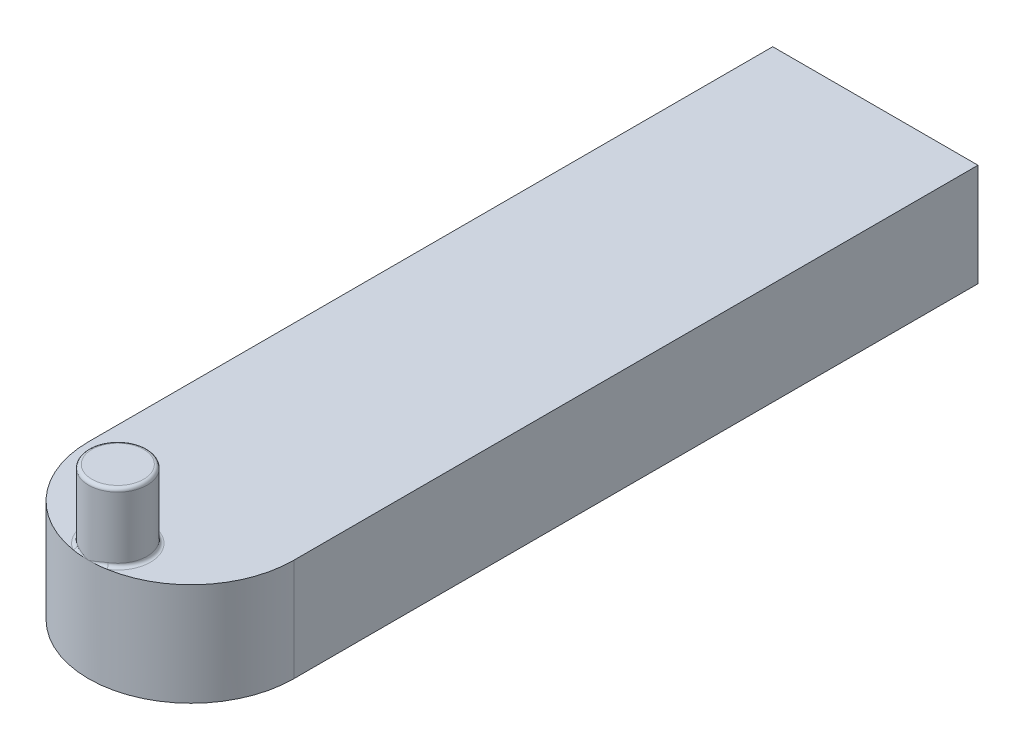
ISO-10303-21;
HEADER;
FILE_DESCRIPTION(('STEP AP214'),'2;1');
FILE_NAME('part.step','',(''),(''),'','','');
FILE_SCHEMA(('AUTOMOTIVE_DESIGN { 1 0 10303 214 1 1 1 1 }'));
ENDSEC;
DATA;
#1=APPLICATION_CONTEXT('core data for automotive mechanical design processes');
#2=APPLICATION_PROTOCOL_DEFINITION('international standard','automotive_design',2000,#1);
#3=PRODUCT_CONTEXT('',#1,'mechanical');
#4=PRODUCT('Part','Part','',(#3));
#5=PRODUCT_RELATED_PRODUCT_CATEGORY('part','',(#4));
#6=PRODUCT_DEFINITION_FORMATION('','',#4);
#7=PRODUCT_DEFINITION_CONTEXT('part definition',#1,'design');
#8=PRODUCT_DEFINITION('design','',#6,#7);
#9=PRODUCT_DEFINITION_SHAPE('','',#8);
#10=(LENGTH_UNIT() NAMED_UNIT(*) SI_UNIT(.MILLI.,.METRE.));
#11=(NAMED_UNIT(*) PLANE_ANGLE_UNIT() SI_UNIT($,.RADIAN.));
#12=(NAMED_UNIT(*) SI_UNIT($,.STERADIAN.) SOLID_ANGLE_UNIT());
#13=UNCERTAINTY_MEASURE_WITH_UNIT(LENGTH_MEASURE(1.E-05),#10,'distance_accuracy_value','');
#14=(GEOMETRIC_REPRESENTATION_CONTEXT(3) GLOBAL_UNCERTAINTY_ASSIGNED_CONTEXT((#13)) GLOBAL_UNIT_ASSIGNED_CONTEXT((#10,
#11,#12)) REPRESENTATION_CONTEXT('',''));
#15=CARTESIAN_POINT('',(0.,0.,0.));
#16=DIRECTION('',(0.,0.,1.));
#17=DIRECTION('',(1.,0.,0.));
#18=AXIS2_PLACEMENT_3D('',#15,#16,#17);
#19=CARTESIAN_POINT('',(0.,6.,0.));
#20=DIRECTION('',(0.,-1.,0.));
#21=DIRECTION('',(0.,0.,-1.));
#22=AXIS2_PLACEMENT_3D('',#19,#20,#21);
#23=CYLINDRICAL_SURFACE('',#22,6.);
#24=CARTESIAN_POINT('',(0.,0.,0.));
#25=DIRECTION('',(0.,1.,0.));
#26=DIRECTION('',(0.,0.,1.));
#27=AXIS2_PLACEMENT_3D('',#24,#25,#26);
#28=CIRCLE('',#27,6.);
#29=CARTESIAN_POINT('',(-6.,0.,0.));
#30=VERTEX_POINT('',#29);
#31=CARTESIAN_POINT('',(6.,0.,0.));
#32=VERTEX_POINT('',#31);
#33=EDGE_CURVE('E240',#30,#32,#28,.T.);
#34=ORIENTED_EDGE('',*,*,#33,.T.);
#35=DIRECTION('',(0.,-1.,0.));
#36=VECTOR('',#35,1.);
#37=CARTESIAN_POINT('',(6.,6.,0.));
#38=LINE('',#37,#36);
#39=CARTESIAN_POINT('',(6.,6.,0.));
#40=VERTEX_POINT('',#39);
#41=EDGE_CURVE('E216',#40,#32,#38,.T.);
#42=ORIENTED_EDGE('',*,*,#41,.F.);
#43=CARTESIAN_POINT('',(0.,6.,0.));
#44=DIRECTION('',(0.,1.,0.));
#45=DIRECTION('',(0.,0.,1.));
#46=AXIS2_PLACEMENT_3D('',#43,#44,#45);
#47=CIRCLE('',#46,6.);
#48=CARTESIAN_POINT('',(1.00376067843676,6.,5.91544288286382));
#49=VERTEX_POINT('',#48);
#50=EDGE_CURVE('E116',#49,#40,#47,.T.);
#51=ORIENTED_EDGE('',*,*,#50,.F.);
#52=CARTESIAN_POINT('',(0.,6.,6.));
#53=VERTEX_POINT('',#52);
#54=EDGE_CURVE('E120',#53,#49,#47,.T.);
#55=ORIENTED_EDGE('',*,*,#54,.F.);
#56=CARTESIAN_POINT('',(-1.00376067843676,6.,5.91544288286382));
#57=VERTEX_POINT('',#56);
#58=EDGE_CURVE('E70',#57,#53,#47,.T.);
#59=ORIENTED_EDGE('',*,*,#58,.F.);
#60=CARTESIAN_POINT('',(-6.,6.,0.));
#61=VERTEX_POINT('',#60);
#62=EDGE_CURVE('E123',#61,#57,#47,.T.);
#63=ORIENTED_EDGE('',*,*,#62,.F.);
#64=DIRECTION('',(0.,-1.,0.));
#65=VECTOR('',#64,1.);
#66=CARTESIAN_POINT('',(-6.,6.,0.));
#67=LINE('',#66,#65);
#68=EDGE_CURVE('E230',#61,#30,#67,.T.);
#69=ORIENTED_EDGE('',*,*,#68,.T.);
#70=EDGE_LOOP('',(#34,#42,#51,#55,#59,#63,#69));
#71=FACE_BOUND('',#70,.T.);
#72=ADVANCED_FACE('F41',(#71),#23,.T.);
#73=CARTESIAN_POINT('',(6.,6.,0.));
#74=DIRECTION('',(-1.,0.,0.));
#75=DIRECTION('',(0.,0.,1.));
#76=AXIS2_PLACEMENT_3D('',#73,#74,#75);
#77=PLANE('',#76);
#78=DIRECTION('',(0.,0.,-1.));
#79=VECTOR('',#78,1.);
#80=CARTESIAN_POINT('',(6.,0.,0.));
#81=LINE('',#80,#79);
#82=CARTESIAN_POINT('',(6.,0.,-40.));
#83=VERTEX_POINT('',#82);
#84=EDGE_CURVE('E235',#32,#83,#81,.T.);
#85=ORIENTED_EDGE('',*,*,#84,.T.);
#86=DIRECTION('',(0.,-1.,0.));
#87=VECTOR('',#86,1.);
#88=CARTESIAN_POINT('',(6.,6.,-40.));
#89=LINE('',#88,#87);
#90=CARTESIAN_POINT('',(6.,6.,-40.));
#91=VERTEX_POINT('',#90);
#92=EDGE_CURVE('E217',#91,#83,#89,.T.);
#93=ORIENTED_EDGE('',*,*,#92,.F.);
#94=DIRECTION('',(0.,0.,-1.));
#95=VECTOR('',#94,1.);
#96=CARTESIAN_POINT('',(6.,6.,0.));
#97=LINE('',#96,#95);
#98=EDGE_CURVE('E243',#40,#91,#97,.T.);
#99=ORIENTED_EDGE('',*,*,#98,.F.);
#100=ORIENTED_EDGE('',*,*,#41,.T.);
#101=EDGE_LOOP('',(#85,#93,#99,#100));
#102=FACE_BOUND('',#101,.T.);
#103=ADVANCED_FACE('F168',(#102),#77,.F.);
#104=CARTESIAN_POINT('',(-6.,6.,-40.));
#105=DIRECTION('',(0.,0.,1.));
#106=DIRECTION('',(1.,0.,0.));
#107=AXIS2_PLACEMENT_3D('',#104,#105,#106);
#108=PLANE('',#107);
#109=CARTESIAN_POINT('',(0.,3.,-40.));
#110=DIRECTION('',(0.,0.,-1.));
#111=DIRECTION('',(-1.,0.,0.));
#112=AXIS2_PLACEMENT_3D('',#109,#110,#111);
#113=CIRCLE('',#112,2.5);
#114=CARTESIAN_POINT('',(-2.5,3.,-40.));
#115=VERTEX_POINT('',#114);
#116=EDGE_CURVE('E184',#115,#115,#113,.T.);
#117=ORIENTED_EDGE('',*,*,#116,.F.);
#118=EDGE_LOOP('',(#117));
#119=FACE_BOUND('',#118,.T.);
#120=DIRECTION('',(-1.,0.,0.));
#121=VECTOR('',#120,1.);
#122=CARTESIAN_POINT('',(-6.,0.,-40.));
#123=LINE('',#122,#121);
#124=CARTESIAN_POINT('',(-6.,0.,-40.));
#125=VERTEX_POINT('',#124);
#126=EDGE_CURVE('E234',#83,#125,#123,.T.);
#127=ORIENTED_EDGE('',*,*,#126,.T.);
#128=DIRECTION('',(0.,-1.,0.));
#129=VECTOR('',#128,1.);
#130=CARTESIAN_POINT('',(-6.,6.,-40.));
#131=LINE('',#130,#129);
#132=CARTESIAN_POINT('',(-6.,6.,-40.));
#133=VERTEX_POINT('',#132);
#134=EDGE_CURVE('E225',#133,#125,#131,.T.);
#135=ORIENTED_EDGE('',*,*,#134,.F.);
#136=DIRECTION('',(-1.,0.,0.));
#137=VECTOR('',#136,1.);
#138=CARTESIAN_POINT('',(-6.,6.,-40.));
#139=LINE('',#138,#137);
#140=EDGE_CURVE('E242',#91,#133,#139,.T.);
#141=ORIENTED_EDGE('',*,*,#140,.F.);
#142=ORIENTED_EDGE('',*,*,#92,.T.);
#143=EDGE_LOOP('',(#127,#135,#141,#142));
#144=FACE_BOUND('',#143,.T.);
#145=ADVANCED_FACE('F260',(#119,#144),#108,.F.);
#146=CARTESIAN_POINT('',(-6.,6.,0.));
#147=DIRECTION('',(1.,0.,0.));
#148=DIRECTION('',(0.,0.,-1.));
#149=AXIS2_PLACEMENT_3D('',#146,#147,#148);
#150=PLANE('',#149);
#151=DIRECTION('',(0.,0.,1.));
#152=VECTOR('',#151,1.);
#153=CARTESIAN_POINT('',(-6.,0.,0.));
#154=LINE('',#153,#152);
#155=EDGE_CURVE('E231',#125,#30,#154,.T.);
#156=ORIENTED_EDGE('',*,*,#155,.T.);
#157=ORIENTED_EDGE('',*,*,#68,.F.);
#158=DIRECTION('',(0.,0.,1.));
#159=VECTOR('',#158,1.);
#160=CARTESIAN_POINT('',(-6.,6.,0.));
#161=LINE('',#160,#159);
#162=EDGE_CURVE('E226',#133,#61,#161,.T.);
#163=ORIENTED_EDGE('',*,*,#162,.F.);
#164=ORIENTED_EDGE('',*,*,#134,.T.);
#165=EDGE_LOOP('',(#156,#157,#163,#164));
#166=FACE_BOUND('',#165,.T.);
#167=ADVANCED_FACE('F257',(#166),#150,.F.);
#168=CARTESIAN_POINT('',(0.,6.,0.));
#169=DIRECTION('',(0.,1.,0.));
#170=DIRECTION('',(0.,0.,1.));
#171=AXIS2_PLACEMENT_3D('',#168,#169,#170);
#172=PLANE('',#171);
#173=ORIENTED_EDGE('',*,*,#62,.T.);
#174=CARTESIAN_POINT('',(0.,6.,4.28736421101754));
#175=DIRECTION('',(0.,1.,0.));
#176=DIRECTION('',(0.,0.,1.));
#177=AXIS2_PLACEMENT_3D('',#174,#175,#176);
#178=CIRCLE('',#177,1.91263578898246);
#179=EDGE_CURVE('E54',#57,#49,#178,.F.);
#180=ORIENTED_EDGE('',*,*,#179,.T.);
#181=ORIENTED_EDGE('',*,*,#50,.T.);
#182=ORIENTED_EDGE('',*,*,#98,.T.);
#183=ORIENTED_EDGE('',*,*,#140,.T.);
#184=ORIENTED_EDGE('',*,*,#162,.T.);
#185=EDGE_LOOP('',(#173,#180,#181,#182,#183,#184));
#186=FACE_BOUND('',#185,.T.);
#187=ADVANCED_FACE('F178',(#186),#172,.T.);
#188=CARTESIAN_POINT('',(0.,0.,0.));
#189=DIRECTION('',(0.,1.,0.));
#190=DIRECTION('',(0.,0.,1.));
#191=AXIS2_PLACEMENT_3D('',#188,#189,#190);
#192=PLANE('',#191);
#193=ORIENTED_EDGE('',*,*,#33,.F.);
#194=ORIENTED_EDGE('',*,*,#155,.F.);
#195=ORIENTED_EDGE('',*,*,#126,.F.);
#196=ORIENTED_EDGE('',*,*,#84,.F.);
#197=EDGE_LOOP('',(#193,#194,#195,#196));
#198=FACE_BOUND('',#197,.T.);
#199=ADVANCED_FACE('F255',(#198),#192,.F.);
#200=CARTESIAN_POINT('',(0.,3.,-36.2));
#201=DIRECTION('',(0.,0.,-1.));
#202=DIRECTION('',(-1.,0.,0.));
#203=AXIS2_PLACEMENT_3D('',#200,#201,#202);
#204=CYLINDRICAL_SURFACE('',#203,2.5);
#205=CARTESIAN_POINT('',(0.,3.,-36.2));
#206=DIRECTION('',(0.,0.,-1.));
#207=DIRECTION('',(-1.,0.,0.));
#208=AXIS2_PLACEMENT_3D('',#205,#206,#207);
#209=CIRCLE('',#208,2.5);
#210=CARTESIAN_POINT('',(-2.5,3.,-36.2));
#211=VERTEX_POINT('',#210);
#212=EDGE_CURVE('E239',#211,#211,#209,.T.);
#213=CARTESIAN_POINT('',(-2.5,3.,-36.2));
#214=CARTESIAN_POINT('',(-2.5,3.,-36.2395833333333));
#215=CARTESIAN_POINT('',(-2.5,3.,-36.2791666666667));
#216=CARTESIAN_POINT('',(-2.5,3.,-36.3583333333333));
#217=CARTESIAN_POINT('',(-2.5,3.,-36.3979166666667));
#218=CARTESIAN_POINT('',(-2.5,3.,-36.4770833333333));
#219=CARTESIAN_POINT('',(-2.5,3.,-36.5166666666667));
#220=CARTESIAN_POINT('',(-2.5,3.,-36.5958333333333));
#221=CARTESIAN_POINT('',(-2.5,3.,-36.6354166666667));
#222=CARTESIAN_POINT('',(-2.5,3.,-36.7145833333333));
#223=CARTESIAN_POINT('',(-2.5,3.,-36.7541666666667));
#224=CARTESIAN_POINT('',(-2.5,3.,-36.8333333333333));
#225=CARTESIAN_POINT('',(-2.5,3.,-36.8729166666667));
#226=CARTESIAN_POINT('',(-2.5,3.,-36.9520833333333));
#227=CARTESIAN_POINT('',(-2.5,3.,-36.9916666666667));
#228=CARTESIAN_POINT('',(-2.5,3.,-37.0708333333333));
#229=CARTESIAN_POINT('',(-2.5,3.,-37.1104166666667));
#230=CARTESIAN_POINT('',(-2.5,3.,-37.1895833333333));
#231=CARTESIAN_POINT('',(-2.5,3.,-37.2291666666667));
#232=CARTESIAN_POINT('',(-2.5,3.,-37.3083333333333));
#233=CARTESIAN_POINT('',(-2.5,3.,-37.3479166666667));
#234=CARTESIAN_POINT('',(-2.5,3.,-37.4270833333333));
#235=CARTESIAN_POINT('',(-2.5,3.,-37.4666666666667));
#236=CARTESIAN_POINT('',(-2.5,3.,-37.5458333333333));
#237=CARTESIAN_POINT('',(-2.5,3.,-37.5854166666667));
#238=CARTESIAN_POINT('',(-2.5,3.,-37.6645833333333));
#239=CARTESIAN_POINT('',(-2.5,3.,-37.7041666666667));
#240=CARTESIAN_POINT('',(-2.5,3.,-37.7833333333333));
#241=CARTESIAN_POINT('',(-2.5,3.,-37.8229166666667));
#242=CARTESIAN_POINT('',(-2.5,3.,-37.9020833333333));
#243=CARTESIAN_POINT('',(-2.5,3.,-37.9416666666667));
#244=CARTESIAN_POINT('',(-2.5,3.,-38.0208333333333));
#245=CARTESIAN_POINT('',(-2.5,3.,-38.0604166666667));
#246=CARTESIAN_POINT('',(-2.5,3.,-38.1395833333333));
#247=CARTESIAN_POINT('',(-2.5,3.,-38.1791666666667));
#248=CARTESIAN_POINT('',(-2.5,3.,-38.2583333333333));
#249=CARTESIAN_POINT('',(-2.5,3.,-38.2979166666667));
#250=CARTESIAN_POINT('',(-2.5,3.,-38.3770833333333));
#251=CARTESIAN_POINT('',(-2.5,3.,-38.4166666666667));
#252=CARTESIAN_POINT('',(-2.5,3.,-38.4958333333333));
#253=CARTESIAN_POINT('',(-2.5,3.,-38.5354166666667));
#254=CARTESIAN_POINT('',(-2.5,3.,-38.6145833333333));
#255=CARTESIAN_POINT('',(-2.5,3.,-38.6541666666667));
#256=CARTESIAN_POINT('',(-2.5,3.,-38.7333333333333));
#257=CARTESIAN_POINT('',(-2.5,3.,-38.7729166666667));
#258=CARTESIAN_POINT('',(-2.5,3.,-38.8520833333333));
#259=CARTESIAN_POINT('',(-2.5,3.,-38.8916666666667));
#260=CARTESIAN_POINT('',(-2.5,3.,-38.9708333333333));
#261=CARTESIAN_POINT('',(-2.5,3.,-39.0104166666667));
#262=CARTESIAN_POINT('',(-2.5,3.,-39.0895833333333));
#263=CARTESIAN_POINT('',(-2.5,3.,-39.1291666666667));
#264=CARTESIAN_POINT('',(-2.5,3.,-39.2083333333333));
#265=CARTESIAN_POINT('',(-2.5,3.,-39.2479166666667));
#266=CARTESIAN_POINT('',(-2.5,3.,-39.3270833333333));
#267=CARTESIAN_POINT('',(-2.5,3.,-39.3666666666667));
#268=CARTESIAN_POINT('',(-2.5,3.,-39.4458333333333));
#269=CARTESIAN_POINT('',(-2.5,3.,-39.4854166666667));
#270=CARTESIAN_POINT('',(-2.5,3.,-39.5645833333333));
#271=CARTESIAN_POINT('',(-2.5,3.,-39.6041666666667));
#272=CARTESIAN_POINT('',(-2.5,3.,-39.6833333333333));
#273=CARTESIAN_POINT('',(-2.5,3.,-39.7229166666667));
#274=CARTESIAN_POINT('',(-2.5,3.,-39.8020833333333));
#275=CARTESIAN_POINT('',(-2.5,3.,-39.8416666666667));
#276=CARTESIAN_POINT('',(-2.5,3.,-39.9208333333333));
#277=CARTESIAN_POINT('',(-2.5,3.,-39.9604166666667));
#278=CARTESIAN_POINT('',(-2.5,3.,-40.));
#279=B_SPLINE_CURVE_WITH_KNOTS('',3,(#213,#214,#215,#216,#217,#218,#219,#220,#221,#222,#223,
#224,#225,#226,#227,#228,#229,#230,#231,#232,#233,#234,#235,#236,#237,#238,#239,#240,#241,#242,
#243,#244,#245,#246,#247,#248,#249,#250,#251,#252,#253,#254,#255,#256,#257,#258,#259,#260,#261,
#262,#263,#264,#265,#266,#267,#268,#269,#270,#271,#272,#273,#274,#275,#276,#277,#278),
.UNSPECIFIED.,.F.,.F.,(4,2,2,2,2,2,2,2,2,2,2,2,2,2,2,2,2,2,2,2,2,2,2,2,2,2,2,2,2,2,2,2,4),(0.,
0.118750000000001,0.237500000000002,0.356250000000002,0.475000000000003,0.593750000000004,
0.712500000000005,0.831250000000006,0.950000000000006,1.06875,1.1875,1.30625,1.425,1.54375,
1.6625,1.78125000000001,1.90000000000001,2.01875,2.1375,2.25625,2.375,2.49375,2.6125,2.73125,
2.85000000000001,2.96875,3.0875,3.20625,3.325,3.44375,3.5625,3.68125,3.8),.UNSPECIFIED.);
#280=EDGE_CURVE('BSEAM253',#211,#115,#279,.T.);
#281=ORIENTED_EDGE('',*,*,#212,.F.);
#282=ORIENTED_EDGE('',*,*,#116,.T.);
#283=ORIENTED_EDGE('',*,*,#280,.T.);
#284=ORIENTED_EDGE('',*,*,#280,.F.);
#285=EDGE_LOOP('',(#281,#283,#282,#284));
#286=FACE_BOUND('',#285,.T.);
#287=ADVANCED_FACE('F253',(#286),#204,.F.);
#288=CARTESIAN_POINT('',(0.,3.,-36.2));
#289=DIRECTION('',(0.,0.,-1.));
#290=DIRECTION('',(-1.,0.,0.));
#291=AXIS2_PLACEMENT_3D('',#288,#289,#290);
#292=PLANE('',#291);
#293=ORIENTED_EDGE('',*,*,#212,.T.);
#294=EDGE_LOOP('',(#293));
#295=FACE_BOUND('',#294,.T.);
#296=ADVANCED_FACE('F148',(#295),#292,.T.);
#297=CARTESIAN_POINT('',(0.,10.,4.28736421101754));
#298=DIRECTION('',(0.,-1.,0.));
#299=DIRECTION('',(0.,0.,-1.));
#300=AXIS2_PLACEMENT_3D('',#297,#298,#299);
#301=CYLINDRICAL_SURFACE('',#300,1.71263578898246);
#302=CARTESIAN_POINT('',(0.,9.8,4.28736421101754));
#303=DIRECTION('',(0.,1.,0.));
#304=DIRECTION('',(0.,0.,1.));
#305=AXIS2_PLACEMENT_3D('',#302,#303,#304);
#306=CIRCLE('',#305,1.71263578898246);
#307=CARTESIAN_POINT('',(0.,9.8,6.));
#308=VERTEX_POINT('',#307);
#309=EDGE_CURVE('E111',#308,#308,#306,.F.);
#310=ORIENTED_EDGE('',*,*,#309,.T.);
#311=EDGE_LOOP('',(#310));
#312=FACE_BOUND('',#311,.T.);
#313=CARTESIAN_POINT('',(-1.10362027494016,6.16040876764696,5.596999135126));
#314=CARTESIAN_POINT('',(-1.07392393181936,6.04940916337383,5.62202403768197));
#315=CARTESIAN_POINT('',(-1.12570605823589,5.99544261039352,5.71277233372481));
#316=CARTESIAN_POINT('',(-1.17748818465243,5.94147605741321,5.80352062976766));
#317=CARTESIAN_POINT('',(-1.2575361103215,6.,5.86673699182412));
#318=CARTESIAN_POINT('',(-1.09236767903785,6.16613691793416,5.60648476366699));
#319=CARTESIAN_POINT('',(-1.06609376265228,6.05620363846328,5.62819678950179));
#320=CARTESIAN_POINT('',(-1.11616543940342,6.00095368428732,5.71582240875918));
#321=CARTESIAN_POINT('',(-1.16635032887943,5.94564245760393,5.80340407462129));
#322=CARTESIAN_POINT('',(-1.24306167825845,6.,5.86984027051));
#323=CARTESIAN_POINT('',(-1.08081503984894,6.17103730845203,5.61596884417266));
#324=CARTESIAN_POINT('',(-1.05746016137671,6.06250200209805,5.63493180941202));
#325=CARTESIAN_POINT('',(-1.10595483210962,6.00621520048694,5.719540458888));
#326=CARTESIAN_POINT('',(-1.15455884848977,5.94987837759979,5.80410468076141));
#327=CARTESIAN_POINT('',(-1.22830767745955,6.,5.87294607745664));
#328=CARTESIAN_POINT('',(-1.05724483635811,6.17944543409534,5.63479869554535));
#329=CARTESIAN_POINT('',(-1.03902498366976,6.07402302198034,5.64905547888374));
#330=CARTESIAN_POINT('',(-1.08452404787114,6.01613304891352,5.72790672150632));
#331=CARTESIAN_POINT('',(-1.13012743299186,5.95819422255486,5.80671895809462));
#332=CARTESIAN_POINT('',(-1.19841695463239,6.,5.87911789320459));
#333=CARTESIAN_POINT('',(-1.04522844021578,6.18295644597016,5.64414474118595));
#334=CARTESIAN_POINT('',(-1.02922928122056,6.07926402946304,5.65644256983814));
#335=CARTESIAN_POINT('',(-1.0733063238025,6.02079078743279,5.73255270607934));
#336=CARTESIAN_POINT('',(-1.11748675208471,5.96227982616956,5.80861902137718));
#337=CARTESIAN_POINT('',(-1.18328122374208,6.,5.8821839789499));
#338=CARTESIAN_POINT('',(-1.00881527904941,6.19178023438353,5.67168117201816));
#339=CARTESIAN_POINT('',(-0.998853576341396,6.09330260353677,5.67882559761954));
#340=CARTESIAN_POINT('',(-1.03876354670046,6.03366264157788,5.74721905756214));
#341=CARTESIAN_POINT('',(-1.07907664052009,5.97387088487856,5.81544121033618));
#342=CARTESIAN_POINT('',(-1.13772513934186,6.,5.89122516721694));
#343=CARTESIAN_POINT('',(-0.983855547876399,6.19547347846402,5.68953827010489));
#344=CARTESIAN_POINT('',(-0.97686489761374,6.10073098929436,5.69438149558873));
#345=CARTESIAN_POINT('',(-1.01437268252251,6.04087413383236,5.75803454128341));
#346=CARTESIAN_POINT('',(-1.05224484874056,5.9809298808975,5.82152877680649));
#347=CARTESIAN_POINT('',(-1.10689986091944,6.,5.89709832189814));
#348=CARTESIAN_POINT('',(-0.933568036833873,6.19970878559658,5.72349469726827));
#349=CARTESIAN_POINT('',(-0.931371736194212,6.11213465037369,5.72485949332842));
#350=CARTESIAN_POINT('',(-0.964538977626394,6.05268939312958,5.7799491810919));
#351=CARTESIAN_POINT('',(-0.99804911500248,5.99316380205146,5.83488670733428));
#352=CARTESIAN_POINT('',(-1.04554099896065,6.,5.90828176070843));
#353=CARTESIAN_POINT('',(-0.908267345192504,6.20033142335578,5.73962797406416));
#354=CARTESIAN_POINT('',(-0.90790496794933,6.11625119980216,5.73982118207356));
#355=CARTESIAN_POINT('',(-0.939140874968951,6.05735694603285,5.7910333225342));
#356=CARTESIAN_POINT('',(-0.970680019572279,5.99841870149489,5.84211698814717));
#357=CARTESIAN_POINT('',(-1.01502117949877,6.,5.91360280763719));
#358=CARTESIAN_POINT('',(-0.856871107528202,6.19935788037319,5.77053425345139));
#359=CARTESIAN_POINT('',(-0.859519940527553,6.12201432424907,5.76896586323772));
#360=CARTESIAN_POINT('',(-0.887175476502258,6.06474960853778,5.8130559549107));
#361=CARTESIAN_POINT('',(-0.915130387452459,6.00744314589011,5.85701913813502));
#362=CARTESIAN_POINT('',(-0.953662516896405,6.,5.92380757236332));
#363=CARTESIAN_POINT('',(-0.830775070187462,6.19776029977905,5.78530639157843));
#364=CARTESIAN_POINT('',(-0.83457123191753,6.12369320553082,5.78318513465672));
#365=CARTESIAN_POINT('',(-0.860607453285468,6.06747349101186,5.82399434955995));
#366=CARTESIAN_POINT('',(-0.88690561459026,6.01123742641692,5.86470044468451));
#367=CARTESIAN_POINT('',(-0.922823484663191,6.,5.92869101218141));
#368=CARTESIAN_POINT('',(-0.751152264431024,6.19036950634947,5.8276631948692));
#369=CARTESIAN_POINT('',(-0.758117175970833,6.12578682474698,5.82415996476509));
#370=CARTESIAN_POINT('',(-0.779224555127333,6.07326791496045,5.85608543365978));
#371=CARTESIAN_POINT('',(-0.801385242954254,6.02066944470644,5.88759522417409));
#372=CARTESIAN_POINT('',(-0.829583227203305,6.,5.94270627645453));
#373=CARTESIAN_POINT('',(-0.696646421069457,6.18196440429525,5.85304852301301));
#374=CARTESIAN_POINT('',(-0.704404062058612,6.1233295812667,5.84960054566621));
#375=CARTESIAN_POINT('',(-0.723088374176844,6.07388850271342,5.8763467991047));
#376=CARTESIAN_POINT('',(-0.742555205863136,6.02446965728288,5.90285071396167));
#377=CARTESIAN_POINT('',(-0.766891180697399,6.,5.95112397664384));
#378=CARTESIAN_POINT('',(-0.555950932817349,6.15517969930438,5.90986633918476));
#379=CARTESIAN_POINT('',(-0.565241798646122,6.11069862917963,5.90659211392553));
#380=CARTESIAN_POINT('',(-0.577765287088361,6.06998505513347,5.92260589136898));
#381=CARTESIAN_POINT('',(-0.592122543348691,6.02931889857513,5.93802572299684));
#382=CARTESIAN_POINT('',(-0.607273916849535,6.,5.96998519448999));
#383=CARTESIAN_POINT('',(-0.468555968109517,6.13386446408926,5.9371540500701));
#384=CARTESIAN_POINT('',(-0.476880500495286,6.09712739123847,5.93487394431688));
#385=CARTESIAN_POINT('',(-0.487110474221684,6.06249981603329,5.94578708372088));
#386=CARTESIAN_POINT('',(-0.498365581056978,6.02797042827561,5.95650591134503));
#387=CARTESIAN_POINT('',(-0.510156137855567,6.,5.97906544621832));
#388=CARTESIAN_POINT('',(-0.29187642975855,6.08651977508001,5.97736897751731));
#389=CARTESIAN_POINT('',(-0.297981988160502,6.06442725490788,5.97635937666229));
#390=CARTESIAN_POINT('',(-0.303605021504964,6.04251524296962,5.98024979808449));
#391=CARTESIAN_POINT('',(-0.310211975846502,6.0207236530867,5.9839572019686));
#392=CARTESIAN_POINT('',(-0.316094439649015,6.,5.9924553442687));
#393=CARTESIAN_POINT('',(-0.202598160789053,6.06050435287656,5.99033814153071));
#394=CARTESIAN_POINT('',(-0.206749955735045,6.04524217815681,5.98993799042956));
#395=CARTESIAN_POINT('',(-0.210761613949228,6.03003070212966,5.99156607449004));
#396=CARTESIAN_POINT('',(-0.215061937834043,6.0148584433674,5.99317002494692));
#397=CARTESIAN_POINT('',(-0.219150847714552,6.,5.99677892554685));
#398=CARTESIAN_POINT('',(-0.078452963435728,6.02355128238463,5.99855449952766));
#399=CARTESIAN_POINT('',(-0.0800554554302624,6.01766399812074,5.99849687297664));
#400=CARTESIAN_POINT('',(-0.0816202142198955,6.01177002326518,5.99873761716718));
#401=CARTESIAN_POINT('',(-0.0832271074592672,6.00588262435337,5.99897915146015));
#402=CARTESIAN_POINT('',(-0.0847929969148904,6.,5.99951808721551));
#403=CARTESIAN_POINT('',(-0.0437754830007874,6.01314540169326,5.99979170541662));
#404=CARTESIAN_POINT('',(-0.0446607432083171,6.00985909447386,5.99978337779282));
#405=CARTESIAN_POINT('',(-0.0455429716567191,6.00657224951168,5.99981804963728));
#406=CARTESIAN_POINT('',(-0.0464285853399877,6.00328593292899,5.99985282882923));
#407=CARTESIAN_POINT('',(-0.0473109047768812,6.,5.99993055569069));
#408=CARTESIAN_POINT('',(-0.00606358722998702,6.00182094493423,5.99999194625621));
#409=CARTESIAN_POINT('',(-0.00618601778418956,6.00136571248117,5.99999161303839));
#410=CARTESIAN_POINT('',(-0.0063084165081599,6.00091047479539,5.99999295965904));
#411=CARTESIAN_POINT('',(-0.00643084639361901,6.00045523812108,5.99999429543756));
#412=CARTESIAN_POINT('',(-0.0065532447142821,6.,5.9999973147518));
#413=CARTESIAN_POINT('',(-0.00303179343879855,6.00091047510353,5.99999999624849));
#414=CARTESIAN_POINT('',(-0.00309300386839634,6.00068285733357,5.99999998835596));
#415=CARTESIAN_POINT('',(-0.00315420779998162,6.00045524005438,5.99999999333612));
#416=CARTESIAN_POINT('',(-0.00321541696850603,6.00022761978578,5.9999999877497));
#417=CARTESIAN_POINT('',(-0.00327662102038141,6.,5.99999999863331));
#418=CARTESIAN_POINT('',(0.,6.,6.));
#419=CARTESIAN_POINT('',(4.54747343036706E-10,6.,6.));
#420=CARTESIAN_POINT('',(9.09494686073412E-10,6.,6.));
#421=CARTESIAN_POINT('',(1.36424202911012E-09,6.,6.));
#422=CARTESIAN_POINT('',(1.81898937214682E-09,6.,6.));
#423=(BOUNDED_SURFACE() B_SPLINE_SURFACE(3,2,((#313,#314,#315,#316,#317),(#318,#319,#320,#321,
#322),(#323,#324,#325,#326,#327),(#328,#329,#330,#331,#332),(#333,#334,#335,#336,#337),(#338,
#339,#340,#341,#342),(#343,#344,#345,#346,#347),(#348,#349,#350,#351,#352),(#353,#354,#355,#356,
#357),(#358,#359,#360,#361,#362),(#363,#364,#365,#366,#367),(#368,#369,#370,#371,#372),(#373,
#374,#375,#376,#377),(#378,#379,#380,#381,#382),(#383,#384,#385,#386,#387),(#388,#389,#390,#391,
#392),(#393,#394,#395,#396,#397),(#398,#399,#400,#401,#402),(#403,#404,#405,#406,#407),(#408,
#409,#410,#411,#412),(#413,#414,#415,#416,#417),(#418,#419,#420,#421,#422)),.UNSPECIFIED.,.F.,
.F.,.F.) B_SPLINE_SURFACE_WITH_KNOTS((4,2,2,2,2,2,2,2,2,2,4),(3,2,3),(0.,0.0521465496771838,
0.10416937185672,0.20731037791016,0.307729941711875,0.408212848993321,0.610600578509326,
0.922352298479435,1.2331882705487,1.35350667663893,1.36402504118299),(0.,0.5,1.),
.UNSPECIFIED.) GEOMETRIC_REPRESENTATION_ITEM() RATIONAL_B_SPLINE_SURFACE(((1.,0.862028681452386,
1.,0.862028681452386,1.),(1.,0.866851477096879,1.,0.866851477096879,1.),(1.,0.871435324877196,
1.,0.871435324877196,1.),(1.,0.880165921037569,1.,0.880165921037569,1.),(1.,0.884313680712717,
1.,0.884313680712717,1.),(1.,0.896127227876862,1.,0.896127227876862,1.),(1.,0.903245106314378,
1.,0.903245106314378,1.),(1.,0.916151732985931,1.,0.916151732985931,1.),(1.,0.921970595697205,
1.,0.921970595697205,1.),(1.,0.932724108082803,1.,0.932724108082803,1.),(1.,0.937658197690654,
1.,0.937658197690654,1.),(1.,0.951420268623527,1.,0.951420268623527,1.),(1.,0.959122522995934,
1.,0.959122522995934,1.),(1.,0.975836290574928,1.,0.975836290574928,1.),(1.,0.983306240979894,
1.,0.983306240979894,1.),(1.,0.994129488938435,1.,0.994129488938435,1.),(1.,0.997494814404702,
1.,0.997494814404702,1.),(1.,0.999625537991966,1.,0.999625537991966,1.),(1.,0.99994606861836,1.,
0.99994606861836,1.),(1.,0.999997918202139,1.,0.999997918202139,1.),(1.,1.00000000131101,1.,
1.00000000131101,1.),(1.,1.,1.,1.,1.))) REPRESENTATION_ITEM('') SURFACE());
#424=CARTESIAN_POINT('',(-1.10362027494016,6.16040876764696,5.596999135126));
#425=CARTESIAN_POINT('',(-1.09236767903785,6.16613691793416,5.60648476366699));
#426=CARTESIAN_POINT('',(-1.08081503984894,6.17103730845203,5.61596884417266));
#427=CARTESIAN_POINT('',(-1.05724483635811,6.17944543409534,5.63479869554535));
#428=CARTESIAN_POINT('',(-1.04522844021578,6.18295644597016,5.64414474118595));
#429=CARTESIAN_POINT('',(-1.00881527904941,6.19178023438353,5.67168117201816));
#430=CARTESIAN_POINT('',(-0.9838555478764,6.19547347846402,5.68953827010489));
#431=CARTESIAN_POINT('',(-0.933568036833873,6.19970878559658,5.72349469726827));
#432=CARTESIAN_POINT('',(-0.908267345192504,6.20033142335578,5.73962797406416));
#433=CARTESIAN_POINT('',(-0.856871107528202,6.19935788037319,5.77053425345139));
#434=CARTESIAN_POINT('',(-0.830775070187462,6.19776029977905,5.78530639157843));
#435=CARTESIAN_POINT('',(-0.751152264431023,6.19036950634947,5.8276631948692));
#436=CARTESIAN_POINT('',(-0.696646421069457,6.18196440429525,5.85304852301301));
#437=CARTESIAN_POINT('',(-0.555950932817349,6.15517969930438,5.90986633918476));
#438=CARTESIAN_POINT('',(-0.468555968109517,6.13386446408926,5.9371540500701));
#439=CARTESIAN_POINT('',(-0.29187642975855,6.08651977508001,5.97736897751731));
#440=CARTESIAN_POINT('',(-0.202598160789053,6.06050435287656,5.99033814153071));
#441=CARTESIAN_POINT('',(-0.0784529634357281,6.02355128238463,5.99855449952766));
#442=CARTESIAN_POINT('',(-0.0437754830007878,6.01314540169326,5.99979170541662));
#443=CARTESIAN_POINT('',(-0.00606358722998702,6.00182094493423,5.99999194625621));
#444=CARTESIAN_POINT('',(-0.00303179343879856,6.00091047510353,5.99999999624849));
#445=CARTESIAN_POINT('',(0.,6.,6.));
#446=B_SPLINE_CURVE_WITH_KNOTS('',3,(#424,#425,#426,#427,#428,#429,#430,#431,#432,#433,#434,
#435,#436,#437,#438,#439,#440,#441,#442,#443,#444,#445),.UNSPECIFIED.,.F.,.F.,(4,2,2,2,2,2,2,2,
2,2,4),(0.,0.0521465496771838,0.10416937185672,0.20731037791016,0.307729941711875,
0.408212848993321,0.610600578509326,0.922352298479435,1.2331882705487,1.35350667663893,
1.36402504118299),.UNSPECIFIED.);
#447=CARTESIAN_POINT('',(-0.898799693787322,6.2,5.74519837722143));
#448=VERTEX_POINT('',#447);
#449=EDGE_CURVE('E104',#448,#53,#446,.T.);
#450=ORIENTED_EDGE('',*,*,#449,.T.);
#451=CARTESIAN_POINT('',(1.25753610671342,6.,5.86673699259751));
#452=CARTESIAN_POINT('',(1.17748818055168,5.94147605908745,5.80352063089182));
#453=CARTESIAN_POINT('',(1.12570605550435,5.99544261190589,5.71277233486091));
#454=CARTESIAN_POINT('',(1.07392393045702,6.04940916472433,5.62202403883));
#455=CARTESIAN_POINT('',(1.10362027494027,6.16040876764691,5.59699913512591));
#456=CARTESIAN_POINT('',(1.24306167693182,6.,5.86984027079431));
#457=CARTESIAN_POINT('',(1.16635032738567,5.94564245821394,5.80340407503278));
#458=CARTESIAN_POINT('',(1.11616543839901,6.00095368484333,5.71582240917697));
#459=CARTESIAN_POINT('',(1.06609376215874,6.0562036389531,5.6281967899179));
#460=CARTESIAN_POINT('',(1.0923676790391,6.16613691793353,5.60648476366594));
#461=CARTESIAN_POINT('',(1.2283076770993,6.,5.87294607753384));
#462=CARTESIAN_POINT('',(1.15455884808719,5.94987837776436,5.80410468087311));
#463=CARTESIAN_POINT('',(1.10595483183672,6.00621520063808,5.71954045900157));
#464=CARTESIAN_POINT('',(1.05746016124528,6.06250200222926,5.634931809523));
#465=CARTESIAN_POINT('',(1.08081503985138,6.171037308451,5.61596884417066));
#466=CARTESIAN_POINT('',(1.19841695500107,6.,5.87911789312566));
#467=CARTESIAN_POINT('',(1.13012743339343,5.95819422239097,5.80671895798387));
#468=CARTESIAN_POINT('',(1.08452404815004,6.01613304875966,5.72790672139041));
#469=CARTESIAN_POINT('',(1.03902498380256,6.07402302184888,5.64905547877184));
#470=CARTESIAN_POINT('',(1.05724483636302,6.17944543409375,5.63479869554148));
#471=CARTESIAN_POINT('',(1.18328122387616,6.,5.88218397892131));
#472=CARTESIAN_POINT('',(1.11748675222801,5.96227982611155,5.80861902133816));
#473=CARTESIAN_POINT('',(1.07330632390383,6.02079078737762,5.73255270603726));
#474=CARTESIAN_POINT('',(1.0292292812698,6.07926402941596,5.65644256979701));
#475=CARTESIAN_POINT('',(1.04522844022196,6.18295644596841,5.64414474118117));
#476=CARTESIAN_POINT('',(1.13772513909791,6.,5.89122516726927));
#477=CARTESIAN_POINT('',(1.07907664026195,5.97387088498535,5.81544121040858));
#478=CARTESIAN_POINT('',(1.03876354651614,6.03366264168109,5.74721905763853));
#479=CARTESIAN_POINT('',(0.998853576262633,6.09330260362077,5.67882559768705));
#480=CARTESIAN_POINT('',(1.00881527905465,6.19178023438275,5.67168117201441));
#481=CARTESIAN_POINT('',(1.10689986085387,6.,5.89709832191171));
#482=CARTESIAN_POINT('',(1.05224484867279,5.98092988092509,5.82152877682495));
#483=CARTESIAN_POINT('',(1.01437268247377,6.04087413385945,5.75803454130304));
#484=CARTESIAN_POINT('',(0.976864897594223,6.10073098931601,5.69438149560521));
#485=CARTESIAN_POINT('',(0.983855547879194,6.19547347846377,5.68953827010299));
#486=CARTESIAN_POINT('',(1.04554099902822,6.,5.90828176069454));
#487=CARTESIAN_POINT('',(0.998049115069466,5.99316380202455,5.83488670731608));
#488=CARTESIAN_POINT('',(0.964538977676868,6.05268939310248,5.77994918107146));
#489=CARTESIAN_POINT('',(0.931371736214532,6.11213465035251,5.72485949331154));
#490=CARTESIAN_POINT('',(0.933568036834148,6.19970878559657,5.72349469726809));
#491=CARTESIAN_POINT('',(1.01502117952699,6.,5.91360280763333));
#492=CARTESIAN_POINT('',(0.970680019598258,5.99841870148754,5.84211698814219));
#493=CARTESIAN_POINT('',(0.939140874987734,6.05735694602538,5.7910333225285));
#494=CARTESIAN_POINT('',(0.907904967957472,6.11625119979638,5.73982118206893));
#495=CARTESIAN_POINT('',(0.908267345192801,6.20033142335577,5.73962797406398));
#496=CARTESIAN_POINT('',(0.953662516868956,6.,5.92380757236705));
#497=CARTESIAN_POINT('',(0.915130387427855,6.0074431458972,5.85701913813966));
#498=CARTESIAN_POINT('',(0.887175476484129,6.06474960854516,5.81305595491613));
#499=CARTESIAN_POINT('',(0.859519940520438,6.12201432425468,5.76896586324174));
#500=CARTESIAN_POINT('',(0.856871107528545,6.1993578803732,5.77053425345119));
#501=CARTESIAN_POINT('',(0.922823484619428,6.,5.92869101218269));
#502=CARTESIAN_POINT('',(0.886905614554463,6.01123742641937,5.86470044468605));
#503=CARTESIAN_POINT('',(0.860607453262134,6.06747349101445,5.82399434956177));
#504=CARTESIAN_POINT('',(0.834571231906164,6.12369320553277,5.78318513465797));
#505=CARTESIAN_POINT('',(0.830775070187828,6.19776029977908,5.78530639157823));
#506=CARTESIAN_POINT('',(0.829583227292574,6.,5.94270627645178));
#507=CARTESIAN_POINT('',(0.801385243025939,6.0206694447015,5.88759522417085));
#508=CARTESIAN_POINT('',(0.779224555175381,6.07326791495518,5.85608543365568));
#509=CARTESIAN_POINT('',(0.758117175994077,6.12578682474309,5.82415996476223));
#510=CARTESIAN_POINT('',(0.751152264431457,6.19036950634953,5.82766319486899));
#511=CARTESIAN_POINT('',(0.766891181120799,6.,5.95112397664292));
#512=CARTESIAN_POINT('',(0.742555206194608,6.0244696572813,5.90285071396058));
#513=CARTESIAN_POINT('',(0.723088374389788,6.07388850271174,5.87634679910328));
#514=CARTESIAN_POINT('',(0.70440406216906,6.12332958126549,5.8496005456652));
#515=CARTESIAN_POINT('',(0.696646421069935,6.18196440429533,5.8530485230128));
#516=CARTESIAN_POINT('',(0.607273916198673,6.,5.96998519449125));
#517=CARTESIAN_POINT('',(0.59212254284845,6.02931889857747,5.93802572299811));
#518=CARTESIAN_POINT('',(0.577765286761608,6.0699850551361,5.92260589137076));
#519=CARTESIAN_POINT('',(0.565241798480456,6.11069862918161,5.90659211392643));
#520=CARTESIAN_POINT('',(0.55595093281791,6.15517969930451,5.90986633918457));
#521=CARTESIAN_POINT('',(0.510156134757156,6.,5.97906544621859));
#522=CARTESIAN_POINT('',(0.49836557869388,6.02797042827622,5.95650591134524));
#523=CARTESIAN_POINT('',(0.487110472672361,6.06249981603402,5.94578708372122));
#524=CARTESIAN_POINT('',(0.476880499708196,6.09712739123906,5.93487394431696));
#525=CARTESIAN_POINT('',(0.468555968110114,6.13386446408941,5.93715405006993));
#526=CARTESIAN_POINT('',(0.316094442740208,6.,5.99245534426831));
#527=CARTESIAN_POINT('',(0.31021197817862,6.02072365308614,5.98395720196818));
#528=CARTESIAN_POINT('',(0.303605023051304,6.04251524296903,5.98024979808387));
#529=CARTESIAN_POINT('',(0.297981988938034,6.0644272549075,5.97635937666192));
#530=CARTESIAN_POINT('',(0.291876429759216,6.0865197750802,5.9773689775172));
#531=CARTESIAN_POINT('',(0.219150859410356,6.,5.99677892554678));
#532=CARTESIAN_POINT('',(0.215061946628073,6.01485844336736,5.99317002494682));
#533=CARTESIAN_POINT('',(0.210761619797537,6.03003070212966,5.9915660744899));
#534=CARTESIAN_POINT('',(0.206749958666807,6.04524217815689,5.98993799042944));
#535=CARTESIAN_POINT('',(0.202598160789751,6.06050435287676,5.99033814153062));
#536=CARTESIAN_POINT('',(0.0847929923882526,6.,5.99951808721553));
#537=CARTESIAN_POINT('',(0.0832271040631526,6.00588262435345,5.99897915146016));
#538=CARTESIAN_POINT('',(0.0816202119567953,6.01177002326529,5.9987376171672));
#539=CARTESIAN_POINT('',(0.0800554542985673,6.01766399812089,5.99849687297664));
#540=CARTESIAN_POINT('',(0.0784529634362119,6.02355128238479,5.99855449952765));
#541=CARTESIAN_POINT('',(0.0473108926814538,6.,5.99993055569069));
#542=CARTESIAN_POINT('',(0.0464285762679891,6.00328593292901,5.99985282882923));
#543=CARTESIAN_POINT('',(0.0455429656091235,6.00657224951173,5.99981804963728));
#544=CARTESIAN_POINT('',(0.0446607401844792,6.00985909447393,5.99978337779282));
#545=CARTESIAN_POINT('',(0.0437754830010273,6.01314540169335,5.99979170541662));
#546=CARTESIAN_POINT('',(0.0065532457714517,6.,5.9999973147518));
#547=CARTESIAN_POINT('',(0.00643084718649761,6.00045523812108,5.99999429543756));
#548=CARTESIAN_POINT('',(0.00630841703674461,6.0009104747954,5.99999295965903));
#549=CARTESIAN_POINT('',(0.00618601804848193,6.00136571248117,5.99999161303839));
#550=CARTESIAN_POINT('',(0.00606358722998651,6.00182094493423,5.99999194625621));
#551=CARTESIAN_POINT('',(0.0032766232852302,6.,5.99999999863331));
#552=CARTESIAN_POINT('',(0.00321541866714243,6.00022761978578,5.9999999877497));
#553=CARTESIAN_POINT('',(0.00315420893240606,6.00045524005438,5.99999999333612));
#554=CARTESIAN_POINT('',(0.00309300443460812,6.00068285733357,5.99999998835596));
#555=CARTESIAN_POINT('',(0.00303179343879829,6.00091047510354,5.99999999624849));
#556=CARTESIAN_POINT('',(1.81898937214682E-09,6.,6.));
#557=CARTESIAN_POINT('',(1.36424202911012E-09,6.,6.));
#558=CARTESIAN_POINT('',(9.09494686073412E-10,6.,6.));
#559=CARTESIAN_POINT('',(4.54747343036706E-10,6.,6.));
#560=CARTESIAN_POINT('',(0.,6.,6.));
#561=(BOUNDED_SURFACE() B_SPLINE_SURFACE(3,2,((#451,#452,#453,#454,#455),(#456,#457,#458,#459,
#460),(#461,#462,#463,#464,#465),(#466,#467,#468,#469,#470),(#471,#472,#473,#474,#475),(#476,
#477,#478,#479,#480),(#481,#482,#483,#484,#485),(#486,#487,#488,#489,#490),(#491,#492,#493,#494,
#495),(#496,#497,#498,#499,#500),(#501,#502,#503,#504,#505),(#506,#507,#508,#509,#510),(#511,
#512,#513,#514,#515),(#516,#517,#518,#519,#520),(#521,#522,#523,#524,#525),(#526,#527,#528,#529,
#530),(#531,#532,#533,#534,#535),(#536,#537,#538,#539,#540),(#541,#542,#543,#544,#545),(#546,
#547,#548,#549,#550),(#551,#552,#553,#554,#555),(#556,#557,#558,#559,#560)),.UNSPECIFIED.,.F.,
.F.,.F.) B_SPLINE_SURFACE_WITH_KNOTS((4,2,2,2,2,2,2,2,2,2,4),(3,2,3),(0.,0.0521465496719426,
0.104169371846269,0.207310377909974,0.307729941711623,0.408212848992991,0.610600578508851,
0.922352298478857,1.23318827054802,1.3535066766391,1.36402504118315),(0.,0.5,1.),
.UNSPECIFIED.) GEOMETRIC_REPRESENTATION_ITEM() RATIONAL_B_SPLINE_SURFACE(((1.,0.862028682745046,
1.,0.862028682745046,1.),(1.,0.866851477572111,1.,0.866851477572111,1.),(1.,0.871435325006361,
1.,0.871435325006361,1.),(1.,0.880165920906,1.,0.880165920906,1.),(1.,0.884313680665458,1.,
0.884313680665458,1.),(1.,0.896127227964887,1.,0.896127227964887,1.),(1.,0.903245106337379,1.,
0.903245106337379,1.),(1.,0.916151732962753,1.,0.916151732962753,1.),(1.,0.921970595690796,1.,
0.921970595690796,1.),(1.,0.932724108089079,1.,0.932724108089079,1.),(1.,0.937658197692832,1.,
0.937658197692832,1.),(1.,0.951420268618973,1.,0.951420268618973,1.),(1.,0.959122522994442,1.,
0.959122522994442,1.),(1.,0.975836290577086,1.,0.975836290577086,1.),(1.,0.983306240980408,1.,
0.983306240980408,1.),(1.,0.99412948893782,1.,0.99412948893782,1.),(1.,0.997494814404599,1.,
0.997494814404599,1.),(1.,0.999625537991995,1.,0.999625537991995,1.),(1.,0.999946068618363,1.,
0.999946068618363,1.),(1.,0.999997918202139,1.,0.999997918202139,1.),(1.,1.00000000131101,1.,
1.00000000131101,1.),(1.,1.,1.,1.,1.))) REPRESENTATION_ITEM('') SURFACE());
#562=CARTESIAN_POINT('',(1.10362027494027,6.16040876764691,5.59699913512591));
#563=CARTESIAN_POINT('',(1.0923676790391,6.16613691793353,5.60648476366594));
#564=CARTESIAN_POINT('',(1.08081503985138,6.171037308451,5.61596884417066));
#565=CARTESIAN_POINT('',(1.05724483636302,6.17944543409375,5.63479869554148));
#566=CARTESIAN_POINT('',(1.04522844022196,6.18295644596841,5.64414474118117));
#567=CARTESIAN_POINT('',(1.00881527905465,6.19178023438275,5.67168117201441));
#568=CARTESIAN_POINT('',(0.983855547879194,6.19547347846378,5.68953827010299));
#569=CARTESIAN_POINT('',(0.933568036834148,6.19970878559657,5.7234946972681));
#570=CARTESIAN_POINT('',(0.908267345192801,6.20033142335577,5.73962797406398));
#571=CARTESIAN_POINT('',(0.856871107528545,6.1993578803732,5.77053425345119));
#572=CARTESIAN_POINT('',(0.830775070187828,6.19776029977908,5.78530639157823));
#573=CARTESIAN_POINT('',(0.751152264431457,6.19036950634953,5.82766319486899));
#574=CARTESIAN_POINT('',(0.696646421069935,6.18196440429533,5.8530485230128));
#575=CARTESIAN_POINT('',(0.55595093281791,6.15517969930451,5.90986633918457));
#576=CARTESIAN_POINT('',(0.468555968110114,6.13386446408941,5.93715405006993));
#577=CARTESIAN_POINT('',(0.291876429759215,6.0865197750802,5.9773689775172));
#578=CARTESIAN_POINT('',(0.202598160789751,6.06050435287676,5.99033814153062));
#579=CARTESIAN_POINT('',(0.078452963436212,6.02355128238479,5.99855449952765));
#580=CARTESIAN_POINT('',(0.0437754830010277,6.01314540169335,5.99979170541662));
#581=CARTESIAN_POINT('',(0.00606358722998651,6.00182094493423,5.99999194625621));
#582=CARTESIAN_POINT('',(0.00303179343879829,6.00091047510354,5.99999999624849));
#583=CARTESIAN_POINT('',(0.,6.,6.));
#584=B_SPLINE_CURVE_WITH_KNOTS('',3,(#562,#563,#564,#565,#566,#567,#568,#569,#570,#571,#572,
#573,#574,#575,#576,#577,#578,#579,#580,#581,#582,#583),.UNSPECIFIED.,.F.,.F.,(4,2,2,2,2,2,2,2,
2,2,4),(0.,0.0521465496719426,0.104169371846269,0.207310377909974,0.307729941711623,
0.408212848992991,0.610600578508851,0.922352298478857,1.23318827054802,1.3535066766391,
1.36402504118315),.UNSPECIFIED.);
#585=CARTESIAN_POINT('',(0.898799693787323,6.2,5.74519837722143));
#586=VERTEX_POINT('',#585);
#587=EDGE_CURVE('E107',#53,#586,#584,.F.);
#588=ORIENTED_EDGE('',*,*,#587,.T.);
#589=CARTESIAN_POINT('',(0.,6.2,4.28736421101754));
#590=DIRECTION('',(0.,1.,0.));
#591=DIRECTION('',(0.,0.,1.));
#592=AXIS2_PLACEMENT_3D('',#589,#590,#591);
#593=CIRCLE('',#592,1.71263578898246);
#594=EDGE_CURVE('E109',#586,#448,#593,.T.);
#595=ORIENTED_EDGE('',*,*,#594,.T.);
#596=EDGE_LOOP('',(#450,#588,#595));
#597=FACE_BOUND('',#596,.T.);
#598=ADVANCED_FACE('F106',(#312,#597),#301,.T.);
#599=CARTESIAN_POINT('',(0.,10.,4.28736421101754));
#600=DIRECTION('',(0.,1.,0.));
#601=DIRECTION('',(0.,0.,1.));
#602=AXIS2_PLACEMENT_3D('',#599,#600,#601);
#603=PLANE('',#602);
#604=CARTESIAN_POINT('',(0.,10.,4.28736421101754));
#605=DIRECTION('',(0.,1.,0.));
#606=DIRECTION('',(0.,0.,1.));
#607=AXIS2_PLACEMENT_3D('',#604,#605,#606);
#608=CIRCLE('',#607,1.51263578898246);
#609=CARTESIAN_POINT('',(0.,10.,5.8));
#610=VERTEX_POINT('',#609);
#611=EDGE_CURVE('E11',#610,#610,#608,.T.);
#612=ORIENTED_EDGE('',*,*,#611,.T.);
#613=EDGE_LOOP('',(#612));
#614=FACE_BOUND('',#613,.T.);
#615=ADVANCED_FACE('F144',(#614),#603,.T.);
#616=ORIENTED_EDGE('',*,*,#58,.T.);
#617=ORIENTED_EDGE('',*,*,#449,.F.);
#618=CARTESIAN_POINT('',(-1.00376067843676,6.2,5.91544288286382));
#619=DIRECTION('',(-0.851222528211934,0.,-0.524804923247184));
#620=DIRECTION('',(-0.524804923247184,0.,0.851222528211934));
#621=AXIS2_PLACEMENT_3D('',#618,#619,#620);
#622=CIRCLE('',#621,0.2);
#623=EDGE_CURVE('E127',#57,#448,#622,.F.);
#624=ORIENTED_EDGE('',*,*,#623,.F.);
#625=EDGE_LOOP('',(#616,#617,#624));
#626=FACE_BOUND('',#625,.T.);
#627=ADVANCED_FACE('F125',(#626),#423,.F.);
#628=CARTESIAN_POINT('',(0.,6.2,4.28736421101754));
#629=DIRECTION('',(0.,1.,0.));
#630=DIRECTION('',(0.,0.,1.));
#631=AXIS2_PLACEMENT_3D('',#628,#629,#630);
#632=TOROIDAL_SURFACE('',#631,1.91263578898246,0.2);
#633=ORIENTED_EDGE('',*,*,#623,.T.);
#634=ORIENTED_EDGE('',*,*,#594,.F.);
#635=CARTESIAN_POINT('',(1.00376067843676,6.2,5.91544288286382));
#636=DIRECTION('',(0.851222528211932,0.,-0.524804923247187));
#637=DIRECTION('',(-0.524804923247187,0.,-0.851222528211933));
#638=AXIS2_PLACEMENT_3D('',#635,#636,#637);
#639=CIRCLE('',#638,0.2);
#640=EDGE_CURVE('E126',#49,#586,#639,.T.);
#641=ORIENTED_EDGE('',*,*,#640,.F.);
#642=ORIENTED_EDGE('',*,*,#179,.F.);
#643=EDGE_LOOP('',(#633,#634,#641,#642));
#644=FACE_BOUND('',#643,.T.);
#645=ADVANCED_FACE('F195',(#644),#632,.F.);
#646=ORIENTED_EDGE('',*,*,#587,.F.);
#647=ORIENTED_EDGE('',*,*,#54,.T.);
#648=ORIENTED_EDGE('',*,*,#640,.T.);
#649=EDGE_LOOP('',(#646,#647,#648));
#650=FACE_BOUND('',#649,.T.);
#651=ADVANCED_FACE('F130',(#650),#561,.F.);
#652=CARTESIAN_POINT('',(0.,9.8,4.28736421101754));
#653=DIRECTION('',(0.,1.,0.));
#654=DIRECTION('',(0.,0.,1.));
#655=AXIS2_PLACEMENT_3D('',#652,#653,#654);
#656=TOROIDAL_SURFACE('',#655,1.51263578898246,0.2);
#657=ORIENTED_EDGE('',*,*,#309,.F.);
#658=EDGE_LOOP('',(#657));
#659=FACE_BOUND('',#658,.T.);
#660=ORIENTED_EDGE('',*,*,#611,.F.);
#661=EDGE_LOOP('',(#660));
#662=FACE_BOUND('',#661,.T.);
#663=ADVANCED_FACE('F43',(#659,#662),#656,.T.);
#664=CLOSED_SHELL('',(#72,#103,#145,#167,#187,#199,#287,#296,#598,#615,#627,#645,#651,#663));
#665=MANIFOLD_SOLID_BREP('B2',#664);
#666=ADVANCED_BREP_SHAPE_REPRESENTATION('',(#18,#665),#14);
#667=SHAPE_DEFINITION_REPRESENTATION(#9,#666);
ENDSEC;
END-ISO-10303-21;
